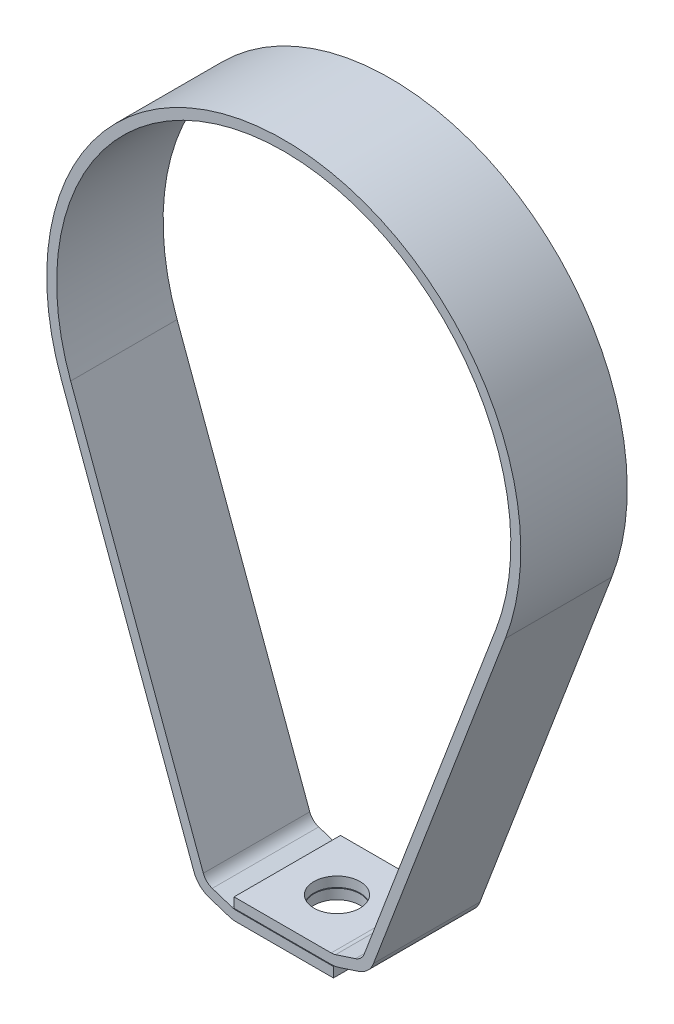
ISO-10303-21;
HEADER;
FILE_DESCRIPTION(('STEP AP214'),'2;1');
FILE_NAME('part.step','',(''),(''),'','','');
FILE_SCHEMA(('AUTOMOTIVE_DESIGN { 1 0 10303 214 1 1 1 1 }'));
ENDSEC;
DATA;
#1=APPLICATION_CONTEXT('core data for automotive mechanical design processes');
#2=APPLICATION_PROTOCOL_DEFINITION('international standard','automotive_design',2000,#1);
#3=PRODUCT_CONTEXT('',#1,'mechanical');
#4=PRODUCT('Part','Part','',(#3));
#5=PRODUCT_RELATED_PRODUCT_CATEGORY('part','',(#4));
#6=PRODUCT_DEFINITION_FORMATION('','',#4);
#7=PRODUCT_DEFINITION_CONTEXT('part definition',#1,'design');
#8=PRODUCT_DEFINITION('design','',#6,#7);
#9=PRODUCT_DEFINITION_SHAPE('','',#8);
#10=(LENGTH_UNIT() NAMED_UNIT(*) SI_UNIT(.MILLI.,.METRE.));
#11=(NAMED_UNIT(*) PLANE_ANGLE_UNIT() SI_UNIT($,.RADIAN.));
#12=(NAMED_UNIT(*) SI_UNIT($,.STERADIAN.) SOLID_ANGLE_UNIT());
#13=UNCERTAINTY_MEASURE_WITH_UNIT(LENGTH_MEASURE(1.E-05),#10,'distance_accuracy_value','');
#14=(GEOMETRIC_REPRESENTATION_CONTEXT(3) GLOBAL_UNCERTAINTY_ASSIGNED_CONTEXT((#13)) GLOBAL_UNIT_ASSIGNED_CONTEXT((#10,
#11,#12)) REPRESENTATION_CONTEXT('',''));
#15=CARTESIAN_POINT('',(0.,0.,0.));
#16=DIRECTION('',(0.,0.,1.));
#17=DIRECTION('',(1.,0.,0.));
#18=AXIS2_PLACEMENT_3D('',#15,#16,#17);
#19=CARTESIAN_POINT('',(0.,0.,7.5));
#20=DIRECTION('',(0.,0.,-1.));
#21=DIRECTION('',(-1.,0.,0.));
#22=AXIS2_PLACEMENT_3D('',#19,#20,#21);
#23=CYLINDRICAL_SURFACE('',#22,32.);
#24=CARTESIAN_POINT('',(0.,0.,-7.5));
#25=DIRECTION('',(0.,0.,-1.));
#26=DIRECTION('',(1.,0.,0.));
#27=AXIS2_PLACEMENT_3D('',#24,#25,#26);
#28=CIRCLE('',#27,32.);
#29=CARTESIAN_POINT('',(-30.0264995285157,-11.0638748214198,-7.5));
#30=VERTEX_POINT('',#29);
#31=CARTESIAN_POINT('',(29.9177759822603,-11.3545885119316,-7.5));
#32=VERTEX_POINT('',#31);
#33=EDGE_CURVE('E515',#30,#32,#28,.T.);
#34=ORIENTED_EDGE('',*,*,#33,.T.);
#35=DIRECTION('',(0.,0.,-1.));
#36=VECTOR('',#35,1.);
#37=CARTESIAN_POINT('',(29.9177759822603,-11.3545885119316,7.5));
#38=LINE('',#37,#36);
#39=CARTESIAN_POINT('',(29.9177759822603,-11.3545885119316,7.5));
#40=VERTEX_POINT('',#39);
#41=EDGE_CURVE('E11',#40,#32,#38,.T.);
#42=ORIENTED_EDGE('',*,*,#41,.F.);
#43=CARTESIAN_POINT('',(0.,0.,7.5));
#44=DIRECTION('',(0.,0.,-1.));
#45=DIRECTION('',(1.,0.,0.));
#46=AXIS2_PLACEMENT_3D('',#43,#44,#45);
#47=CIRCLE('',#46,32.);
#48=CARTESIAN_POINT('',(-30.0264995285157,-11.0638748214198,7.5));
#49=VERTEX_POINT('',#48);
#50=EDGE_CURVE('E579',#49,#40,#47,.T.);
#51=ORIENTED_EDGE('',*,*,#50,.F.);
#52=DIRECTION('',(0.,0.,-1.));
#53=VECTOR('',#52,1.);
#54=CARTESIAN_POINT('',(-30.0264995285157,-11.0638748214198,7.5));
#55=LINE('',#54,#53);
#56=EDGE_CURVE('E528',#49,#30,#55,.T.);
#57=ORIENTED_EDGE('',*,*,#56,.T.);
#58=EDGE_LOOP('',(#34,#42,#51,#57));
#59=FACE_BOUND('',#58,.T.);
#60=ADVANCED_FACE('F350',(#59),#23,.F.);
#61=CARTESIAN_POINT('',(29.9177759822603,-11.3545885119316,7.5));
#62=DIRECTION('',(0.934930499445635,-0.354830890997861,0.));
#63=DIRECTION('',(0.354830890997861,0.934930499445635,0.));
#64=AXIS2_PLACEMENT_3D('',#61,#62,#63);
#65=PLANE('',#64);
#66=DIRECTION('',(-0.354830890997861,-0.934930499445635,0.));
#67=VECTOR('',#66,1.);
#68=CARTESIAN_POINT('',(29.9177759822603,-11.3545885119316,-7.5));
#69=LINE('',#68,#67);
#70=CARTESIAN_POINT('',(11.3401418000534,-60.3040944459956,-7.5));
#71=VERTEX_POINT('',#70);
#72=EDGE_CURVE('E511',#32,#71,#69,.T.);
#73=ORIENTED_EDGE('',*,*,#72,.T.);
#74=DIRECTION('',(0.,0.,-1.));
#75=VECTOR('',#74,1.);
#76=CARTESIAN_POINT('',(11.3401418000534,-60.3040944459956,7.5));
#77=LINE('',#76,#75);
#78=CARTESIAN_POINT('',(11.3401418000534,-60.3040944459956,7.5));
#79=VERTEX_POINT('',#78);
#80=EDGE_CURVE('E358',#79,#71,#77,.T.);
#81=ORIENTED_EDGE('',*,*,#80,.F.);
#82=DIRECTION('',(-0.354830890997861,-0.934930499445635,0.));
#83=VECTOR('',#82,1.);
#84=CARTESIAN_POINT('',(29.9177759822603,-11.3545885119316,7.5));
#85=LINE('',#84,#83);
#86=EDGE_CURVE('E524',#40,#79,#85,.T.);
#87=ORIENTED_EDGE('',*,*,#86,.F.);
#88=ORIENTED_EDGE('',*,*,#41,.T.);
#89=EDGE_LOOP('',(#73,#81,#87,#88));
#90=FACE_BOUND('',#89,.T.);
#91=ADVANCED_FACE('F523',(#90),#65,.F.);
#92=CARTESIAN_POINT('',(9.47028080116208,-59.5944326639999,7.5));
#93=DIRECTION('',(0.,0.,-1.));
#94=DIRECTION('',(-1.,0.,0.));
#95=AXIS2_PLACEMENT_3D('',#92,#93,#94);
#96=CYLINDRICAL_SURFACE('',#95,2.00000000000001);
#97=CARTESIAN_POINT('',(9.47028080116208,-59.5944326639999,-7.5));
#98=DIRECTION('',(0.,0.,-1.));
#99=DIRECTION('',(-1.,0.,0.));
#100=AXIS2_PLACEMENT_3D('',#97,#98,#99);
#101=CIRCLE('',#100,2.00000000000001);
#102=CARTESIAN_POINT('',(10.088314789912,-61.4965456965902,-7.5));
#103=VERTEX_POINT('',#102);
#104=EDGE_CURVE('E517',#71,#103,#101,.T.);
#105=ORIENTED_EDGE('',*,*,#104,.T.);
#106=DIRECTION('',(0.,0.,-1.));
#107=VECTOR('',#106,1.);
#108=CARTESIAN_POINT('',(10.088314789912,-61.4965456965902,7.5));
#109=LINE('',#108,#107);
#110=CARTESIAN_POINT('',(10.088314789912,-61.4965456965902,7.5));
#111=VERTEX_POINT('',#110);
#112=EDGE_CURVE('E685',#111,#103,#109,.T.);
#113=ORIENTED_EDGE('',*,*,#112,.F.);
#114=CARTESIAN_POINT('',(9.47028080116208,-59.5944326639999,7.5));
#115=DIRECTION('',(0.,0.,-1.));
#116=DIRECTION('',(-1.,0.,0.));
#117=AXIS2_PLACEMENT_3D('',#114,#115,#116);
#118=CIRCLE('',#117,2.00000000000001);
#119=EDGE_CURVE('E582',#79,#111,#118,.T.);
#120=ORIENTED_EDGE('',*,*,#119,.F.);
#121=ORIENTED_EDGE('',*,*,#80,.T.);
#122=EDGE_LOOP('',(#105,#113,#120,#121));
#123=FACE_BOUND('',#122,.T.);
#124=ADVANCED_FACE('F690',(#123),#96,.F.);
#125=CARTESIAN_POINT('',(10.088314789912,-61.4965456965902,7.5));
#126=DIRECTION('',(0.309016994374942,-0.951056516295155,0.));
#127=DIRECTION('',(0.951056516295155,0.309016994374942,0.));
#128=AXIS2_PLACEMENT_3D('',#125,#126,#127);
#129=PLANE('',#128);
#130=DIRECTION('',(-0.951056516295155,-0.309016994374942,0.));
#131=VECTOR('',#130,1.);
#132=CARTESIAN_POINT('',(10.088314789912,-61.4965456965902,-7.5));
#133=LINE('',#132,#131);
#134=CARTESIAN_POINT('',(7.30126510810082,-62.4021130325903,-7.5));
#135=VERTEX_POINT('',#134);
#136=EDGE_CURVE('E537',#103,#135,#133,.T.);
#137=ORIENTED_EDGE('',*,*,#136,.T.);
#138=DIRECTION('',(0.,0.,-1.));
#139=VECTOR('',#138,1.);
#140=CARTESIAN_POINT('',(7.30126510810082,-62.4021130325903,7.5));
#141=LINE('',#140,#139);
#142=CARTESIAN_POINT('',(7.30126510810082,-62.4021130325903,7.5));
#143=VERTEX_POINT('',#142);
#144=EDGE_CURVE('E682',#143,#135,#141,.T.);
#145=ORIENTED_EDGE('',*,*,#144,.F.);
#146=DIRECTION('',(-0.951056516295155,-0.309016994374942,0.));
#147=VECTOR('',#146,1.);
#148=CARTESIAN_POINT('',(10.088314789912,-61.4965456965902,7.5));
#149=LINE('',#148,#147);
#150=EDGE_CURVE('E584',#111,#143,#149,.T.);
#151=ORIENTED_EDGE('',*,*,#150,.F.);
#152=ORIENTED_EDGE('',*,*,#112,.T.);
#153=EDGE_LOOP('',(#137,#145,#151,#152));
#154=FACE_BOUND('',#153,.T.);
#155=ADVANCED_FACE('F698',(#154),#129,.F.);
#156=CARTESIAN_POINT('',(6.68323111935093,-60.5,7.5));
#157=DIRECTION('',(0.,0.,-1.));
#158=DIRECTION('',(-1.,0.,0.));
#159=AXIS2_PLACEMENT_3D('',#156,#157,#158);
#160=CYLINDRICAL_SURFACE('',#159,2.);
#161=CARTESIAN_POINT('',(6.68323111935093,-60.5,-7.5));
#162=DIRECTION('',(0.,0.,-1.));
#163=DIRECTION('',(-1.,0.,0.));
#164=AXIS2_PLACEMENT_3D('',#161,#162,#163);
#165=CIRCLE('',#164,2.);
#166=CARTESIAN_POINT('',(6.68323111935093,-62.5,-7.5));
#167=VERTEX_POINT('',#166);
#168=EDGE_CURVE('E539',#135,#167,#165,.T.);
#169=ORIENTED_EDGE('',*,*,#168,.T.);
#170=DIRECTION('',(0.,0.,-1.));
#171=VECTOR('',#170,1.);
#172=CARTESIAN_POINT('',(6.68323111935093,-62.5,7.5));
#173=LINE('',#172,#171);
#174=CARTESIAN_POINT('',(6.68323111935093,-62.5,7.5));
#175=VERTEX_POINT('',#174);
#176=EDGE_CURVE('E679',#175,#167,#173,.T.);
#177=ORIENTED_EDGE('',*,*,#176,.F.);
#178=CARTESIAN_POINT('',(6.68323111935093,-60.5,7.5));
#179=DIRECTION('',(0.,0.,-1.));
#180=DIRECTION('',(-1.,0.,0.));
#181=AXIS2_PLACEMENT_3D('',#178,#179,#180);
#182=CIRCLE('',#181,2.);
#183=EDGE_CURVE('E586',#143,#175,#182,.T.);
#184=ORIENTED_EDGE('',*,*,#183,.F.);
#185=ORIENTED_EDGE('',*,*,#144,.T.);
#186=EDGE_LOOP('',(#169,#177,#184,#185));
#187=FACE_BOUND('',#186,.T.);
#188=ADVANCED_FACE('F701',(#187),#160,.F.);
#189=CARTESIAN_POINT('',(6.68323111935093,-62.5,7.5));
#190=DIRECTION('',(0.,-1.,0.));
#191=DIRECTION('',(0.,0.,-1.));
#192=AXIS2_PLACEMENT_3D('',#189,#190,#191);
#193=PLANE('',#192);
#194=CARTESIAN_POINT('',(0.,-62.5,0.));
#195=DIRECTION('',(0.,-1.,0.));
#196=DIRECTION('',(0.,0.,-1.));
#197=AXIS2_PLACEMENT_3D('',#194,#195,#196);
#198=CIRCLE('',#197,3.25);
#199=CARTESIAN_POINT('',(0.,-62.5,-3.25));
#200=VERTEX_POINT('',#199);
#201=EDGE_CURVE('E529',#200,#200,#198,.T.);
#202=ORIENTED_EDGE('',*,*,#201,.T.);
#203=EDGE_LOOP('',(#202));
#204=FACE_BOUND('',#203,.T.);
#205=DIRECTION('',(-1.,0.,0.));
#206=VECTOR('',#205,1.);
#207=CARTESIAN_POINT('',(6.68323111935093,-62.5,-7.5));
#208=LINE('',#207,#206);
#209=CARTESIAN_POINT('',(-6.99999999999999,-62.5,-7.5));
#210=VERTEX_POINT('',#209);
#211=EDGE_CURVE('E541',#167,#210,#208,.T.);
#212=ORIENTED_EDGE('',*,*,#211,.T.);
#213=DIRECTION('',(0.,0.,-1.));
#214=VECTOR('',#213,1.);
#215=CARTESIAN_POINT('',(-6.99999999999999,-62.5,7.5));
#216=LINE('',#215,#214);
#217=CARTESIAN_POINT('',(-6.99999999999999,-62.5,7.5));
#218=VERTEX_POINT('',#217);
#219=EDGE_CURVE('E676',#218,#210,#216,.T.);
#220=ORIENTED_EDGE('',*,*,#219,.F.);
#221=DIRECTION('',(-1.,0.,0.));
#222=VECTOR('',#221,1.);
#223=CARTESIAN_POINT('',(6.68323111935093,-62.5,7.5));
#224=LINE('',#223,#222);
#225=EDGE_CURVE('E588',#175,#218,#224,.T.);
#226=ORIENTED_EDGE('',*,*,#225,.F.);
#227=ORIENTED_EDGE('',*,*,#176,.T.);
#228=EDGE_LOOP('',(#212,#220,#226,#227));
#229=FACE_BOUND('',#228,.T.);
#230=ADVANCED_FACE('F706',(#204,#229),#193,.F.);
#231=CARTESIAN_POINT('',(-6.99999999999999,-62.5,7.5));
#232=DIRECTION('',(1.,0.,0.));
#233=DIRECTION('',(0.,0.,-1.));
#234=AXIS2_PLACEMENT_3D('',#231,#232,#233);
#235=PLANE('',#234);
#236=DIRECTION('',(0.,-1.,0.));
#237=VECTOR('',#236,1.);
#238=CARTESIAN_POINT('',(-6.99999999999999,-62.5,-7.5));
#239=LINE('',#238,#237);
#240=CARTESIAN_POINT('',(-6.99999999999999,-63.9,-7.5));
#241=VERTEX_POINT('',#240);
#242=EDGE_CURVE('E543',#210,#241,#239,.T.);
#243=ORIENTED_EDGE('',*,*,#242,.T.);
#244=DIRECTION('',(0.,0.,-1.));
#245=VECTOR('',#244,1.);
#246=CARTESIAN_POINT('',(-6.99999999999999,-63.9,7.5));
#247=LINE('',#246,#245);
#248=CARTESIAN_POINT('',(-6.99999999999999,-63.9,7.5));
#249=VERTEX_POINT('',#248);
#250=EDGE_CURVE('E673',#249,#241,#247,.T.);
#251=ORIENTED_EDGE('',*,*,#250,.F.);
#252=DIRECTION('',(0.,-1.,0.));
#253=VECTOR('',#252,1.);
#254=CARTESIAN_POINT('',(-6.99999999999999,-62.5,7.5));
#255=LINE('',#254,#253);
#256=EDGE_CURVE('E590',#218,#249,#255,.T.);
#257=ORIENTED_EDGE('',*,*,#256,.F.);
#258=ORIENTED_EDGE('',*,*,#219,.T.);
#259=EDGE_LOOP('',(#243,#251,#257,#258));
#260=FACE_BOUND('',#259,.T.);
#261=ADVANCED_FACE('F712',(#260),#235,.F.);
#262=CARTESIAN_POINT('',(6.68323111935093,-63.9,7.5));
#263=DIRECTION('',(0.,1.,0.));
#264=DIRECTION('',(0.,0.,1.));
#265=AXIS2_PLACEMENT_3D('',#262,#263,#264);
#266=PLANE('',#265);
#267=CARTESIAN_POINT('',(0.,-63.9,0.));
#268=DIRECTION('',(0.,1.,0.));
#269=DIRECTION('',(0.,0.,1.));
#270=AXIS2_PLACEMENT_3D('',#267,#268,#269);
#271=CIRCLE('',#270,3.25);
#272=CARTESIAN_POINT('',(0.,-63.9,3.25));
#273=VERTEX_POINT('',#272);
#274=EDGE_CURVE('E532',#273,#273,#271,.T.);
#275=ORIENTED_EDGE('',*,*,#274,.T.);
#276=EDGE_LOOP('',(#275));
#277=FACE_BOUND('',#276,.T.);
#278=DIRECTION('',(1.,0.,0.));
#279=VECTOR('',#278,1.);
#280=CARTESIAN_POINT('',(6.68323111935093,-63.9,-7.5));
#281=LINE('',#280,#279);
#282=CARTESIAN_POINT('',(6.68323111935093,-63.9,-7.5));
#283=VERTEX_POINT('',#282);
#284=EDGE_CURVE('E545',#241,#283,#281,.T.);
#285=ORIENTED_EDGE('',*,*,#284,.T.);
#286=DIRECTION('',(0.,0.,-1.));
#287=VECTOR('',#286,1.);
#288=CARTESIAN_POINT('',(6.68323111935093,-63.9,7.5));
#289=LINE('',#288,#287);
#290=CARTESIAN_POINT('',(6.68323111935093,-63.9,7.5));
#291=VERTEX_POINT('',#290);
#292=EDGE_CURVE('E670',#291,#283,#289,.T.);
#293=ORIENTED_EDGE('',*,*,#292,.F.);
#294=DIRECTION('',(1.,0.,0.));
#295=VECTOR('',#294,1.);
#296=CARTESIAN_POINT('',(6.68323111935093,-63.9,7.5));
#297=LINE('',#296,#295);
#298=EDGE_CURVE('E592',#249,#291,#297,.T.);
#299=ORIENTED_EDGE('',*,*,#298,.F.);
#300=ORIENTED_EDGE('',*,*,#250,.T.);
#301=EDGE_LOOP('',(#285,#293,#299,#300));
#302=FACE_BOUND('',#301,.T.);
#303=ADVANCED_FACE('F716',(#277,#302),#266,.F.);
#304=CARTESIAN_POINT('',(6.68323111935093,-60.5,7.5));
#305=DIRECTION('',(0.,0.,-1.));
#306=DIRECTION('',(-1.,0.,0.));
#307=AXIS2_PLACEMENT_3D('',#304,#305,#306);
#308=CYLINDRICAL_SURFACE('',#307,3.4);
#309=CARTESIAN_POINT('',(6.68323111935093,-60.5,-7.5));
#310=DIRECTION('',(0.,0.,1.));
#311=DIRECTION('',(-1.,0.,0.));
#312=AXIS2_PLACEMENT_3D('',#309,#310,#311);
#313=CIRCLE('',#312,3.4);
#314=CARTESIAN_POINT('',(7.73388890022574,-63.7335921554035,-7.5));
#315=VERTEX_POINT('',#314);
#316=EDGE_CURVE('E547',#283,#315,#313,.T.);
#317=ORIENTED_EDGE('',*,*,#316,.T.);
#318=DIRECTION('',(0.,0.,-1.));
#319=VECTOR('',#318,1.);
#320=CARTESIAN_POINT('',(7.73388890022574,-63.7335921554035,7.5));
#321=LINE('',#320,#319);
#322=CARTESIAN_POINT('',(7.73388890022574,-63.7335921554035,7.5));
#323=VERTEX_POINT('',#322);
#324=EDGE_CURVE('E667',#323,#315,#321,.T.);
#325=ORIENTED_EDGE('',*,*,#324,.F.);
#326=CARTESIAN_POINT('',(6.68323111935093,-60.5,7.5));
#327=DIRECTION('',(0.,0.,1.));
#328=DIRECTION('',(-1.,0.,0.));
#329=AXIS2_PLACEMENT_3D('',#326,#327,#328);
#330=CIRCLE('',#329,3.4);
#331=EDGE_CURVE('E594',#291,#323,#330,.T.);
#332=ORIENTED_EDGE('',*,*,#331,.F.);
#333=ORIENTED_EDGE('',*,*,#292,.T.);
#334=EDGE_LOOP('',(#317,#325,#332,#333));
#335=FACE_BOUND('',#334,.T.);
#336=ADVANCED_FACE('F721',(#335),#308,.T.);
#337=CARTESIAN_POINT('',(10.5209385820369,-62.8280248194034,7.5));
#338=DIRECTION('',(-0.309016994374947,0.951056516295154,0.));
#339=DIRECTION('',(-0.951056516295154,-0.309016994374947,0.));
#340=AXIS2_PLACEMENT_3D('',#337,#338,#339);
#341=PLANE('',#340);
#342=DIRECTION('',(0.951056516295154,0.309016994374947,0.));
#343=VECTOR('',#342,1.);
#344=CARTESIAN_POINT('',(10.5209385820369,-62.8280248194034,-7.5));
#345=LINE('',#344,#343);
#346=CARTESIAN_POINT('',(10.5209385820369,-62.8280248194034,-7.5));
#347=VERTEX_POINT('',#346);
#348=EDGE_CURVE('E549',#315,#347,#345,.T.);
#349=ORIENTED_EDGE('',*,*,#348,.T.);
#350=DIRECTION('',(0.,0.,-1.));
#351=VECTOR('',#350,1.);
#352=CARTESIAN_POINT('',(10.5209385820369,-62.8280248194034,7.5));
#353=LINE('',#352,#351);
#354=CARTESIAN_POINT('',(10.5209385820369,-62.8280248194034,7.5));
#355=VERTEX_POINT('',#354);
#356=EDGE_CURVE('E664',#355,#347,#353,.T.);
#357=ORIENTED_EDGE('',*,*,#356,.F.);
#358=DIRECTION('',(0.951056516295154,0.309016994374947,0.));
#359=VECTOR('',#358,1.);
#360=CARTESIAN_POINT('',(10.5209385820369,-62.8280248194034,7.5));
#361=LINE('',#360,#359);
#362=EDGE_CURVE('E596',#323,#355,#361,.T.);
#363=ORIENTED_EDGE('',*,*,#362,.F.);
#364=ORIENTED_EDGE('',*,*,#324,.T.);
#365=EDGE_LOOP('',(#349,#357,#363,#364));
#366=FACE_BOUND('',#365,.T.);
#367=ADVANCED_FACE('F727',(#366),#341,.F.);
#368=CARTESIAN_POINT('',(9.47028080116208,-59.5944326639999,7.5));
#369=DIRECTION('',(0.,0.,-1.));
#370=DIRECTION('',(-1.,0.,0.));
#371=AXIS2_PLACEMENT_3D('',#368,#369,#370);
#372=CYLINDRICAL_SURFACE('',#371,3.4);
#373=CARTESIAN_POINT('',(9.47028080116208,-59.5944326639999,-7.5));
#374=DIRECTION('',(0.,0.,1.));
#375=DIRECTION('',(-1.,0.,0.));
#376=AXIS2_PLACEMENT_3D('',#373,#374,#375);
#377=CIRCLE('',#376,3.4);
#378=CARTESIAN_POINT('',(12.6490444992772,-60.8008576933926,-7.5));
#379=VERTEX_POINT('',#378);
#380=EDGE_CURVE('E551',#347,#379,#377,.T.);
#381=ORIENTED_EDGE('',*,*,#380,.T.);
#382=DIRECTION('',(0.,0.,-1.));
#383=VECTOR('',#382,1.);
#384=CARTESIAN_POINT('',(12.6490444992772,-60.8008576933926,7.5));
#385=LINE('',#384,#383);
#386=CARTESIAN_POINT('',(12.6490444992772,-60.8008576933926,7.5));
#387=VERTEX_POINT('',#386);
#388=EDGE_CURVE('E661',#387,#379,#385,.T.);
#389=ORIENTED_EDGE('',*,*,#388,.F.);
#390=CARTESIAN_POINT('',(9.47028080116208,-59.5944326639999,7.5));
#391=DIRECTION('',(0.,0.,1.));
#392=DIRECTION('',(-1.,0.,0.));
#393=AXIS2_PLACEMENT_3D('',#390,#391,#392);
#394=CIRCLE('',#393,3.4);
#395=EDGE_CURVE('E598',#355,#387,#394,.T.);
#396=ORIENTED_EDGE('',*,*,#395,.F.);
#397=ORIENTED_EDGE('',*,*,#356,.T.);
#398=EDGE_LOOP('',(#381,#389,#396,#397));
#399=FACE_BOUND('',#398,.T.);
#400=ADVANCED_FACE('F731',(#399),#372,.T.);
#401=CARTESIAN_POINT('',(31.2266786814842,-11.8513517593286,7.5));
#402=DIRECTION('',(-0.934930499445635,0.354830890997861,0.));
#403=DIRECTION('',(-0.354830890997861,-0.934930499445635,0.));
#404=AXIS2_PLACEMENT_3D('',#401,#402,#403);
#405=PLANE('',#404);
#406=DIRECTION('',(0.354830890997861,0.934930499445635,0.));
#407=VECTOR('',#406,1.);
#408=CARTESIAN_POINT('',(31.2266786814842,-11.8513517593286,-7.5));
#409=LINE('',#408,#407);
#410=CARTESIAN_POINT('',(31.2266786814842,-11.8513517593286,-7.5));
#411=VERTEX_POINT('',#410);
#412=EDGE_CURVE('E553',#379,#411,#409,.T.);
#413=ORIENTED_EDGE('',*,*,#412,.T.);
#414=DIRECTION('',(0.,0.,-1.));
#415=VECTOR('',#414,1.);
#416=CARTESIAN_POINT('',(31.2266786814842,-11.8513517593286,7.5));
#417=LINE('',#416,#415);
#418=CARTESIAN_POINT('',(31.2266786814842,-11.8513517593286,7.5));
#419=VERTEX_POINT('',#418);
#420=EDGE_CURVE('E658',#419,#411,#417,.T.);
#421=ORIENTED_EDGE('',*,*,#420,.F.);
#422=DIRECTION('',(0.354830890997861,0.934930499445635,0.));
#423=VECTOR('',#422,1.);
#424=CARTESIAN_POINT('',(31.2266786814842,-11.8513517593286,7.5));
#425=LINE('',#424,#423);
#426=EDGE_CURVE('E600',#387,#419,#425,.T.);
#427=ORIENTED_EDGE('',*,*,#426,.F.);
#428=ORIENTED_EDGE('',*,*,#388,.T.);
#429=EDGE_LOOP('',(#413,#421,#427,#428));
#430=FACE_BOUND('',#429,.T.);
#431=ADVANCED_FACE('F736',(#430),#405,.F.);
#432=CARTESIAN_POINT('',(0.,0.,7.5));
#433=DIRECTION('',(0.,0.,-1.));
#434=DIRECTION('',(-1.,0.,0.));
#435=AXIS2_PLACEMENT_3D('',#432,#433,#434);
#436=CYLINDRICAL_SURFACE('',#435,33.4);
#437=CARTESIAN_POINT('',(0.,0.,-7.5));
#438=DIRECTION('',(0.,0.,1.));
#439=DIRECTION('',(1.,0.,0.));
#440=AXIS2_PLACEMENT_3D('',#437,#438,#439);
#441=CIRCLE('',#440,33.4);
#442=CARTESIAN_POINT('',(-31.3401588828883,-11.5479193448569,-7.5));
#443=VERTEX_POINT('',#442);
#444=EDGE_CURVE('E555',#411,#443,#441,.T.);
#445=ORIENTED_EDGE('',*,*,#444,.T.);
#446=DIRECTION('',(0.,0.,-1.));
#447=VECTOR('',#446,1.);
#448=CARTESIAN_POINT('',(-31.3401588828883,-11.5479193448569,7.5));
#449=LINE('',#448,#447);
#450=CARTESIAN_POINT('',(-31.3401588828883,-11.5479193448569,7.5));
#451=VERTEX_POINT('',#450);
#452=EDGE_CURVE('E655',#451,#443,#449,.T.);
#453=ORIENTED_EDGE('',*,*,#452,.F.);
#454=CARTESIAN_POINT('',(0.,0.,7.5));
#455=DIRECTION('',(0.,0.,1.));
#456=DIRECTION('',(1.,0.,0.));
#457=AXIS2_PLACEMENT_3D('',#454,#455,#456);
#458=CIRCLE('',#457,33.4);
#459=EDGE_CURVE('E602',#419,#451,#458,.T.);
#460=ORIENTED_EDGE('',*,*,#459,.F.);
#461=ORIENTED_EDGE('',*,*,#420,.T.);
#462=EDGE_LOOP('',(#445,#453,#460,#461));
#463=FACE_BOUND('',#462,.T.);
#464=ADVANCED_FACE('F742',(#463),#436,.T.);
#465=CARTESIAN_POINT('',(-31.3401588828883,-11.5479193448569,7.5));
#466=DIRECTION('',(0.938328110266116,0.345746088169368,0.));
#467=DIRECTION('',(-0.345746088169368,0.938328110266116,0.));
#468=AXIS2_PLACEMENT_3D('',#465,#466,#467);
#469=PLANE('',#468);
#470=DIRECTION('',(0.345746088169368,-0.938328110266116,0.));
#471=VECTOR('',#470,1.);
#472=CARTESIAN_POINT('',(-31.3401588828883,-11.5479193448569,-7.5));
#473=LINE('',#472,#471);
#474=CARTESIAN_POINT('',(-12.6492260101023,-62.273663819631,-7.5));
#475=VERTEX_POINT('',#474);
#476=EDGE_CURVE('E557',#443,#475,#473,.T.);
#477=ORIENTED_EDGE('',*,*,#476,.T.);
#478=DIRECTION('',(0.,0.,-1.));
#479=VECTOR('',#478,1.);
#480=CARTESIAN_POINT('',(-12.6492260101023,-62.273663819631,7.5));
#481=LINE('',#480,#479);
#482=CARTESIAN_POINT('',(-12.6492260101023,-62.273663819631,7.5));
#483=VERTEX_POINT('',#482);
#484=EDGE_CURVE('E652',#483,#475,#481,.T.);
#485=ORIENTED_EDGE('',*,*,#484,.F.);
#486=DIRECTION('',(0.345746088169368,-0.938328110266116,0.));
#487=VECTOR('',#486,1.);
#488=CARTESIAN_POINT('',(-31.3401588828883,-11.5479193448569,7.5));
#489=LINE('',#488,#487);
#490=EDGE_CURVE('E604',#451,#483,#489,.T.);
#491=ORIENTED_EDGE('',*,*,#490,.F.);
#492=ORIENTED_EDGE('',*,*,#452,.T.);
#493=EDGE_LOOP('',(#477,#485,#491,#492));
#494=FACE_BOUND('',#493,.T.);
#495=ADVANCED_FACE('F746',(#494),#469,.F.);
#496=CARTESIAN_POINT('',(-9.45891043519748,-61.0981271198552,7.5));
#497=DIRECTION('',(0.,0.,-1.));
#498=DIRECTION('',(-1.,0.,0.));
#499=AXIS2_PLACEMENT_3D('',#496,#497,#498);
#500=CYLINDRICAL_SURFACE('',#499,3.39999999999999);
#501=CARTESIAN_POINT('',(-9.45891043519748,-61.0981271198552,-7.5));
#502=DIRECTION('',(0.,0.,1.));
#503=DIRECTION('',(1.,0.,0.));
#504=AXIS2_PLACEMENT_3D('',#501,#502,#503);
#505=CIRCLE('',#504,3.39999999999999);
#506=CARTESIAN_POINT('',(-10.5095682160723,-64.3317192752587,-7.5));
#507=VERTEX_POINT('',#506);
#508=EDGE_CURVE('E559',#475,#507,#505,.T.);
#509=ORIENTED_EDGE('',*,*,#508,.T.);
#510=DIRECTION('',(0.,0.,-1.));
#511=VECTOR('',#510,1.);
#512=CARTESIAN_POINT('',(-10.5095682160723,-64.3317192752587,7.5));
#513=LINE('',#512,#511);
#514=CARTESIAN_POINT('',(-10.5095682160723,-64.3317192752587,7.5));
#515=VERTEX_POINT('',#514);
#516=EDGE_CURVE('E649',#515,#507,#513,.T.);
#517=ORIENTED_EDGE('',*,*,#516,.F.);
#518=CARTESIAN_POINT('',(-9.45891043519748,-61.0981271198552,7.5));
#519=DIRECTION('',(0.,0.,1.));
#520=DIRECTION('',(1.,0.,0.));
#521=AXIS2_PLACEMENT_3D('',#518,#519,#520);
#522=CIRCLE('',#521,3.39999999999999);
#523=EDGE_CURVE('E606',#483,#515,#522,.T.);
#524=ORIENTED_EDGE('',*,*,#523,.F.);
#525=ORIENTED_EDGE('',*,*,#484,.T.);
#526=EDGE_LOOP('',(#509,#517,#524,#525));
#527=FACE_BOUND('',#526,.T.);
#528=ADVANCED_FACE('F751',(#527),#500,.T.);
#529=CARTESIAN_POINT('',(-10.5095682160723,-64.3317192752587,7.5));
#530=DIRECTION('',(0.309016994374948,0.951056516295154,0.));
#531=DIRECTION('',(-0.951056516295154,0.309016994374948,0.));
#532=AXIS2_PLACEMENT_3D('',#529,#530,#531);
#533=PLANE('',#532);
#534=DIRECTION('',(0.951056516295154,-0.309016994374948,0.));
#535=VECTOR('',#534,1.);
#536=CARTESIAN_POINT('',(-10.5095682160723,-64.3317192752587,-7.5));
#537=LINE('',#536,#535);
#538=CARTESIAN_POINT('',(-7.73388890022571,-65.2335921554035,-7.5));
#539=VERTEX_POINT('',#538);
#540=EDGE_CURVE('E561',#507,#539,#537,.T.);
#541=ORIENTED_EDGE('',*,*,#540,.T.);
#542=DIRECTION('',(0.,0.,-1.));
#543=VECTOR('',#542,1.);
#544=CARTESIAN_POINT('',(-7.73388890022571,-65.2335921554035,7.5));
#545=LINE('',#544,#543);
#546=CARTESIAN_POINT('',(-7.73388890022571,-65.2335921554035,7.5));
#547=VERTEX_POINT('',#546);
#548=EDGE_CURVE('E646',#547,#539,#545,.T.);
#549=ORIENTED_EDGE('',*,*,#548,.F.);
#550=DIRECTION('',(0.951056516295154,-0.309016994374948,0.));
#551=VECTOR('',#550,1.);
#552=CARTESIAN_POINT('',(-10.5095682160723,-64.3317192752587,7.5));
#553=LINE('',#552,#551);
#554=EDGE_CURVE('E608',#515,#547,#553,.T.);
#555=ORIENTED_EDGE('',*,*,#554,.F.);
#556=ORIENTED_EDGE('',*,*,#516,.T.);
#557=EDGE_LOOP('',(#541,#549,#555,#556));
#558=FACE_BOUND('',#557,.T.);
#559=ADVANCED_FACE('F757',(#558),#533,.F.);
#560=CARTESIAN_POINT('',(-6.68323111935091,-62.,7.5));
#561=DIRECTION('',(0.,0.,-1.));
#562=DIRECTION('',(-1.,0.,0.));
#563=AXIS2_PLACEMENT_3D('',#560,#561,#562);
#564=CYLINDRICAL_SURFACE('',#563,3.39999999999999);
#565=CARTESIAN_POINT('',(-6.68323111935091,-62.,-7.5));
#566=DIRECTION('',(0.,0.,1.));
#567=DIRECTION('',(-1.,0.,0.));
#568=AXIS2_PLACEMENT_3D('',#565,#566,#567);
#569=CIRCLE('',#568,3.39999999999999);
#570=CARTESIAN_POINT('',(-6.68323111935091,-65.4,-7.5));
#571=VERTEX_POINT('',#570);
#572=EDGE_CURVE('E563',#539,#571,#569,.T.);
#573=ORIENTED_EDGE('',*,*,#572,.T.);
#574=DIRECTION('',(0.,0.,-1.));
#575=VECTOR('',#574,1.);
#576=CARTESIAN_POINT('',(-6.68323111935091,-65.4,7.5));
#577=LINE('',#576,#575);
#578=CARTESIAN_POINT('',(-6.68323111935091,-65.4,7.5));
#579=VERTEX_POINT('',#578);
#580=EDGE_CURVE('E643',#579,#571,#577,.T.);
#581=ORIENTED_EDGE('',*,*,#580,.F.);
#582=CARTESIAN_POINT('',(-6.68323111935091,-62.,7.5));
#583=DIRECTION('',(0.,0.,1.));
#584=DIRECTION('',(-1.,0.,0.));
#585=AXIS2_PLACEMENT_3D('',#582,#583,#584);
#586=CIRCLE('',#585,3.39999999999999);
#587=EDGE_CURVE('E610',#547,#579,#586,.T.);
#588=ORIENTED_EDGE('',*,*,#587,.F.);
#589=ORIENTED_EDGE('',*,*,#548,.T.);
#590=EDGE_LOOP('',(#573,#581,#588,#589));
#591=FACE_BOUND('',#590,.T.);
#592=ADVANCED_FACE('F761',(#591),#564,.T.);
#593=CARTESIAN_POINT('',(-6.68323111935091,-65.4,7.5));
#594=DIRECTION('',(0.,1.,0.));
#595=DIRECTION('',(-1.,0.,0.));
#596=AXIS2_PLACEMENT_3D('',#593,#594,#595);
#597=PLANE('',#596);
#598=CARTESIAN_POINT('',(0.,-65.4,0.));
#599=DIRECTION('',(0.,-1.,0.));
#600=DIRECTION('',(0.,0.,-1.));
#601=AXIS2_PLACEMENT_3D('',#598,#599,#600);
#602=CIRCLE('',#601,3.25);
#603=CARTESIAN_POINT('',(0.,-65.4,-3.25));
#604=VERTEX_POINT('',#603);
#605=EDGE_CURVE('E892',#604,#604,#602,.T.);
#606=ORIENTED_EDGE('',*,*,#605,.F.);
#607=EDGE_LOOP('',(#606));
#608=FACE_BOUND('',#607,.T.);
#609=DIRECTION('',(1.,0.,0.));
#610=VECTOR('',#609,1.);
#611=CARTESIAN_POINT('',(-6.68323111935091,-65.4,-7.5));
#612=LINE('',#611,#610);
#613=CARTESIAN_POINT('',(7.00000000000001,-65.4,-7.5));
#614=VERTEX_POINT('',#613);
#615=EDGE_CURVE('E565',#571,#614,#612,.T.);
#616=ORIENTED_EDGE('',*,*,#615,.T.);
#617=DIRECTION('',(0.,0.,-1.));
#618=VECTOR('',#617,1.);
#619=CARTESIAN_POINT('',(7.00000000000001,-65.4,7.5));
#620=LINE('',#619,#618);
#621=CARTESIAN_POINT('',(7.00000000000001,-65.4,7.5));
#622=VERTEX_POINT('',#621);
#623=EDGE_CURVE('E640',#622,#614,#620,.T.);
#624=ORIENTED_EDGE('',*,*,#623,.F.);
#625=DIRECTION('',(1.,0.,0.));
#626=VECTOR('',#625,1.);
#627=CARTESIAN_POINT('',(-6.68323111935091,-65.4,7.5));
#628=LINE('',#627,#626);
#629=EDGE_CURVE('E612',#579,#622,#628,.T.);
#630=ORIENTED_EDGE('',*,*,#629,.F.);
#631=ORIENTED_EDGE('',*,*,#580,.T.);
#632=EDGE_LOOP('',(#616,#624,#630,#631));
#633=FACE_BOUND('',#632,.T.);
#634=ADVANCED_FACE('F766',(#608,#633),#597,.F.);
#635=CARTESIAN_POINT('',(7.00000000000001,-65.4,7.5));
#636=DIRECTION('',(-1.,0.,0.));
#637=DIRECTION('',(0.,0.,1.));
#638=AXIS2_PLACEMENT_3D('',#635,#636,#637);
#639=PLANE('',#638);
#640=DIRECTION('',(0.,1.,0.));
#641=VECTOR('',#640,1.);
#642=CARTESIAN_POINT('',(7.00000000000001,-65.4,-7.5));
#643=LINE('',#642,#641);
#644=CARTESIAN_POINT('',(7.00000000000001,-64.,-7.5));
#645=VERTEX_POINT('',#644);
#646=EDGE_CURVE('E567',#614,#645,#643,.T.);
#647=ORIENTED_EDGE('',*,*,#646,.T.);
#648=DIRECTION('',(0.,0.,-1.));
#649=VECTOR('',#648,1.);
#650=CARTESIAN_POINT('',(7.00000000000001,-64.,7.5));
#651=LINE('',#650,#649);
#652=CARTESIAN_POINT('',(7.00000000000001,-64.,7.5));
#653=VERTEX_POINT('',#652);
#654=EDGE_CURVE('E637',#653,#645,#651,.T.);
#655=ORIENTED_EDGE('',*,*,#654,.F.);
#656=DIRECTION('',(0.,1.,0.));
#657=VECTOR('',#656,1.);
#658=CARTESIAN_POINT('',(7.00000000000001,-65.4,7.5));
#659=LINE('',#658,#657);
#660=EDGE_CURVE('E614',#622,#653,#659,.T.);
#661=ORIENTED_EDGE('',*,*,#660,.F.);
#662=ORIENTED_EDGE('',*,*,#623,.T.);
#663=EDGE_LOOP('',(#647,#655,#661,#662));
#664=FACE_BOUND('',#663,.T.);
#665=ADVANCED_FACE('F772',(#664),#639,.F.);
#666=CARTESIAN_POINT('',(-6.68323111935091,-64.,7.5));
#667=DIRECTION('',(0.,-1.,0.));
#668=DIRECTION('',(0.,0.,-1.));
#669=AXIS2_PLACEMENT_3D('',#666,#667,#668);
#670=PLANE('',#669);
#671=CARTESIAN_POINT('',(0.,-64.,0.));
#672=DIRECTION('',(0.,-1.,0.));
#673=DIRECTION('',(0.,0.,-1.));
#674=AXIS2_PLACEMENT_3D('',#671,#672,#673);
#675=CIRCLE('',#674,3.25);
#676=CARTESIAN_POINT('',(0.,-64.,-3.25));
#677=VERTEX_POINT('',#676);
#678=EDGE_CURVE('E353',#677,#677,#675,.T.);
#679=ORIENTED_EDGE('',*,*,#678,.T.);
#680=EDGE_LOOP('',(#679));
#681=FACE_BOUND('',#680,.T.);
#682=DIRECTION('',(-1.,0.,0.));
#683=VECTOR('',#682,1.);
#684=CARTESIAN_POINT('',(-6.68323111935091,-64.,-7.5));
#685=LINE('',#684,#683);
#686=CARTESIAN_POINT('',(-6.68323111935091,-64.,-7.5));
#687=VERTEX_POINT('',#686);
#688=EDGE_CURVE('E569',#645,#687,#685,.T.);
#689=ORIENTED_EDGE('',*,*,#688,.T.);
#690=DIRECTION('',(0.,0.,-1.));
#691=VECTOR('',#690,1.);
#692=CARTESIAN_POINT('',(-6.68323111935091,-64.,7.5));
#693=LINE('',#692,#691);
#694=CARTESIAN_POINT('',(-6.68323111935091,-64.,7.5));
#695=VERTEX_POINT('',#694);
#696=EDGE_CURVE('E634',#695,#687,#693,.T.);
#697=ORIENTED_EDGE('',*,*,#696,.F.);
#698=DIRECTION('',(-1.,0.,0.));
#699=VECTOR('',#698,1.);
#700=CARTESIAN_POINT('',(-6.68323111935091,-64.,7.5));
#701=LINE('',#700,#699);
#702=EDGE_CURVE('E616',#653,#695,#701,.T.);
#703=ORIENTED_EDGE('',*,*,#702,.F.);
#704=ORIENTED_EDGE('',*,*,#654,.T.);
#705=EDGE_LOOP('',(#689,#697,#703,#704));
#706=FACE_BOUND('',#705,.T.);
#707=ADVANCED_FACE('F776',(#681,#706),#670,.F.);
#708=CARTESIAN_POINT('',(-6.68323111935091,-62.,7.5));
#709=DIRECTION('',(0.,0.,-1.));
#710=DIRECTION('',(-1.,0.,0.));
#711=AXIS2_PLACEMENT_3D('',#708,#709,#710);
#712=CYLINDRICAL_SURFACE('',#711,2.00000000000001);
#713=CARTESIAN_POINT('',(-6.68323111935091,-62.,-7.5));
#714=DIRECTION('',(0.,0.,-1.));
#715=DIRECTION('',(-1.,0.,0.));
#716=AXIS2_PLACEMENT_3D('',#713,#714,#715);
#717=CIRCLE('',#716,2.00000000000001);
#718=CARTESIAN_POINT('',(-7.3012651081008,-63.9021130325903,-7.5));
#719=VERTEX_POINT('',#718);
#720=EDGE_CURVE('E571',#687,#719,#717,.T.);
#721=ORIENTED_EDGE('',*,*,#720,.T.);
#722=DIRECTION('',(0.,0.,-1.));
#723=VECTOR('',#722,1.);
#724=CARTESIAN_POINT('',(-7.3012651081008,-63.9021130325903,7.5));
#725=LINE('',#724,#723);
#726=CARTESIAN_POINT('',(-7.3012651081008,-63.9021130325903,7.5));
#727=VERTEX_POINT('',#726);
#728=EDGE_CURVE('E631',#727,#719,#725,.T.);
#729=ORIENTED_EDGE('',*,*,#728,.F.);
#730=CARTESIAN_POINT('',(-6.68323111935091,-62.,7.5));
#731=DIRECTION('',(0.,0.,-1.));
#732=DIRECTION('',(-1.,0.,0.));
#733=AXIS2_PLACEMENT_3D('',#730,#731,#732);
#734=CIRCLE('',#733,2.00000000000001);
#735=EDGE_CURVE('E618',#695,#727,#734,.T.);
#736=ORIENTED_EDGE('',*,*,#735,.F.);
#737=ORIENTED_EDGE('',*,*,#696,.T.);
#738=EDGE_LOOP('',(#721,#729,#736,#737));
#739=FACE_BOUND('',#738,.T.);
#740=ADVANCED_FACE('F781',(#739),#712,.F.);
#741=CARTESIAN_POINT('',(-10.0769444239474,-63.0002401524455,7.5));
#742=DIRECTION('',(-0.309016994374957,-0.95105651629515,0.));
#743=DIRECTION('',(0.951056516295151,-0.309016994374957,0.));
#744=AXIS2_PLACEMENT_3D('',#741,#742,#743);
#745=PLANE('',#744);
#746=DIRECTION('',(-0.951056516295151,0.309016994374957,0.));
#747=VECTOR('',#746,1.);
#748=CARTESIAN_POINT('',(-10.0769444239474,-63.0002401524455,-7.5));
#749=LINE('',#748,#747);
#750=CARTESIAN_POINT('',(-10.0769444239474,-63.0002401524455,-7.5));
#751=VERTEX_POINT('',#750);
#752=EDGE_CURVE('E573',#719,#751,#749,.T.);
#753=ORIENTED_EDGE('',*,*,#752,.T.);
#754=DIRECTION('',(0.,0.,-1.));
#755=VECTOR('',#754,1.);
#756=CARTESIAN_POINT('',(-10.0769444239474,-63.0002401524455,7.5));
#757=LINE('',#756,#755);
#758=CARTESIAN_POINT('',(-10.0769444239474,-63.0002401524455,7.5));
#759=VERTEX_POINT('',#758);
#760=EDGE_CURVE('E628',#759,#751,#757,.T.);
#761=ORIENTED_EDGE('',*,*,#760,.F.);
#762=DIRECTION('',(-0.951056516295151,0.309016994374957,0.));
#763=VECTOR('',#762,1.);
#764=CARTESIAN_POINT('',(-10.0769444239474,-63.0002401524455,7.5));
#765=LINE('',#764,#763);
#766=EDGE_CURVE('E620',#727,#759,#765,.T.);
#767=ORIENTED_EDGE('',*,*,#766,.F.);
#768=ORIENTED_EDGE('',*,*,#728,.T.);
#769=EDGE_LOOP('',(#753,#761,#767,#768));
#770=FACE_BOUND('',#769,.T.);
#771=ADVANCED_FACE('F785',(#770),#745,.F.);
#772=CARTESIAN_POINT('',(-9.45891043519748,-61.0981271198552,7.5));
#773=DIRECTION('',(0.,0.,-1.));
#774=DIRECTION('',(-1.,0.,0.));
#775=AXIS2_PLACEMENT_3D('',#772,#773,#774);
#776=CYLINDRICAL_SURFACE('',#775,1.99999999999998);
#777=CARTESIAN_POINT('',(-9.45891043519748,-61.0981271198552,-7.5));
#778=DIRECTION('',(0.,0.,-1.));
#779=DIRECTION('',(1.,0.,0.));
#780=AXIS2_PLACEMENT_3D('',#777,#778,#779);
#781=CIRCLE('',#780,1.99999999999998);
#782=CARTESIAN_POINT('',(-11.3355666557297,-61.7896192961939,-7.5));
#783=VERTEX_POINT('',#782);
#784=EDGE_CURVE('E575',#751,#783,#781,.T.);
#785=ORIENTED_EDGE('',*,*,#784,.T.);
#786=DIRECTION('',(0.,0.,-1.));
#787=VECTOR('',#786,1.);
#788=CARTESIAN_POINT('',(-11.3355666557297,-61.7896192961939,7.5));
#789=LINE('',#788,#787);
#790=CARTESIAN_POINT('',(-11.3355666557297,-61.7896192961939,7.5));
#791=VERTEX_POINT('',#790);
#792=EDGE_CURVE('E625',#791,#783,#789,.T.);
#793=ORIENTED_EDGE('',*,*,#792,.F.);
#794=CARTESIAN_POINT('',(-9.45891043519748,-61.0981271198552,7.5));
#795=DIRECTION('',(0.,0.,-1.));
#796=DIRECTION('',(1.,0.,0.));
#797=AXIS2_PLACEMENT_3D('',#794,#795,#796);
#798=CIRCLE('',#797,1.99999999999998);
#799=EDGE_CURVE('E370',#759,#791,#798,.T.);
#800=ORIENTED_EDGE('',*,*,#799,.F.);
#801=ORIENTED_EDGE('',*,*,#760,.T.);
#802=EDGE_LOOP('',(#785,#793,#800,#801));
#803=FACE_BOUND('',#802,.T.);
#804=ADVANCED_FACE('F789',(#803),#776,.F.);
#805=CARTESIAN_POINT('',(-30.0264995285157,-11.0638748214198,7.5));
#806=DIRECTION('',(-0.938328110266116,-0.345746088169368,0.));
#807=DIRECTION('',(0.345746088169368,-0.938328110266116,0.));
#808=AXIS2_PLACEMENT_3D('',#805,#806,#807);
#809=PLANE('',#808);
#810=DIRECTION('',(-0.345746088169368,0.938328110266116,0.));
#811=VECTOR('',#810,1.);
#812=CARTESIAN_POINT('',(-30.0264995285157,-11.0638748214198,-7.5));
#813=LINE('',#812,#811);
#814=EDGE_CURVE('E577',#783,#30,#813,.T.);
#815=ORIENTED_EDGE('',*,*,#814,.T.);
#816=ORIENTED_EDGE('',*,*,#56,.F.);
#817=DIRECTION('',(-0.345746088169368,0.938328110266116,0.));
#818=VECTOR('',#817,1.);
#819=CARTESIAN_POINT('',(-30.0264995285157,-11.0638748214198,7.5));
#820=LINE('',#819,#818);
#821=EDGE_CURVE('E365',#791,#49,#820,.T.);
#822=ORIENTED_EDGE('',*,*,#821,.F.);
#823=ORIENTED_EDGE('',*,*,#792,.T.);
#824=EDGE_LOOP('',(#815,#816,#822,#823));
#825=FACE_BOUND('',#824,.T.);
#826=ADVANCED_FACE('F791',(#825),#809,.F.);
#827=CARTESIAN_POINT('',(0.,0.,7.5));
#828=DIRECTION('',(0.,0.,1.));
#829=DIRECTION('',(1.,0.,0.));
#830=AXIS2_PLACEMENT_3D('',#827,#828,#829);
#831=PLANE('',#830);
#832=ORIENTED_EDGE('',*,*,#50,.T.);
#833=ORIENTED_EDGE('',*,*,#86,.T.);
#834=ORIENTED_EDGE('',*,*,#119,.T.);
#835=ORIENTED_EDGE('',*,*,#150,.T.);
#836=ORIENTED_EDGE('',*,*,#183,.T.);
#837=ORIENTED_EDGE('',*,*,#225,.T.);
#838=ORIENTED_EDGE('',*,*,#256,.T.);
#839=ORIENTED_EDGE('',*,*,#298,.T.);
#840=ORIENTED_EDGE('',*,*,#331,.T.);
#841=ORIENTED_EDGE('',*,*,#362,.T.);
#842=ORIENTED_EDGE('',*,*,#395,.T.);
#843=ORIENTED_EDGE('',*,*,#426,.T.);
#844=ORIENTED_EDGE('',*,*,#459,.T.);
#845=ORIENTED_EDGE('',*,*,#490,.T.);
#846=ORIENTED_EDGE('',*,*,#523,.T.);
#847=ORIENTED_EDGE('',*,*,#554,.T.);
#848=ORIENTED_EDGE('',*,*,#587,.T.);
#849=ORIENTED_EDGE('',*,*,#629,.T.);
#850=ORIENTED_EDGE('',*,*,#660,.T.);
#851=ORIENTED_EDGE('',*,*,#702,.T.);
#852=ORIENTED_EDGE('',*,*,#735,.T.);
#853=ORIENTED_EDGE('',*,*,#766,.T.);
#854=ORIENTED_EDGE('',*,*,#799,.T.);
#855=ORIENTED_EDGE('',*,*,#821,.T.);
#856=EDGE_LOOP('',(#832,#833,#834,#835,#836,#837,#838,#839,#840,#841,#842,#843,#844,#845,#846,
#847,#848,#849,#850,#851,#852,#853,#854,#855));
#857=FACE_BOUND('',#856,.T.);
#858=ADVANCED_FACE('F693',(#857),#831,.T.);
#859=CARTESIAN_POINT('',(0.,0.,-7.5));
#860=DIRECTION('',(0.,0.,1.));
#861=DIRECTION('',(1.,0.,0.));
#862=AXIS2_PLACEMENT_3D('',#859,#860,#861);
#863=PLANE('',#862);
#864=ORIENTED_EDGE('',*,*,#33,.F.);
#865=ORIENTED_EDGE('',*,*,#814,.F.);
#866=ORIENTED_EDGE('',*,*,#784,.F.);
#867=ORIENTED_EDGE('',*,*,#752,.F.);
#868=ORIENTED_EDGE('',*,*,#720,.F.);
#869=ORIENTED_EDGE('',*,*,#688,.F.);
#870=ORIENTED_EDGE('',*,*,#646,.F.);
#871=ORIENTED_EDGE('',*,*,#615,.F.);
#872=ORIENTED_EDGE('',*,*,#572,.F.);
#873=ORIENTED_EDGE('',*,*,#540,.F.);
#874=ORIENTED_EDGE('',*,*,#508,.F.);
#875=ORIENTED_EDGE('',*,*,#476,.F.);
#876=ORIENTED_EDGE('',*,*,#444,.F.);
#877=ORIENTED_EDGE('',*,*,#412,.F.);
#878=ORIENTED_EDGE('',*,*,#380,.F.);
#879=ORIENTED_EDGE('',*,*,#348,.F.);
#880=ORIENTED_EDGE('',*,*,#316,.F.);
#881=ORIENTED_EDGE('',*,*,#284,.F.);
#882=ORIENTED_EDGE('',*,*,#242,.F.);
#883=ORIENTED_EDGE('',*,*,#211,.F.);
#884=ORIENTED_EDGE('',*,*,#168,.F.);
#885=ORIENTED_EDGE('',*,*,#136,.F.);
#886=ORIENTED_EDGE('',*,*,#104,.F.);
#887=ORIENTED_EDGE('',*,*,#72,.F.);
#888=EDGE_LOOP('',(#864,#865,#866,#867,#868,#869,#870,#871,#872,#873,#874,#875,#876,#877,#878,
#879,#880,#881,#882,#883,#884,#885,#886,#887));
#889=FACE_BOUND('',#888,.T.);
#890=ADVANCED_FACE('F512',(#889),#863,.F.);
#891=CARTESIAN_POINT('',(0.,-50.4,0.));
#892=DIRECTION('',(0.,-1.,0.));
#893=DIRECTION('',(0.,0.,-1.));
#894=AXIS2_PLACEMENT_3D('',#891,#892,#893);
#895=CYLINDRICAL_SURFACE('',#894,3.25);
#896=ORIENTED_EDGE('',*,*,#605,.T.);
#897=EDGE_LOOP('',(#896));
#898=FACE_BOUND('',#897,.T.);
#899=ORIENTED_EDGE('',*,*,#678,.F.);
#900=EDGE_LOOP('',(#899));
#901=FACE_BOUND('',#900,.T.);
#902=ADVANCED_FACE('F871',(#898,#901),#895,.F.);
#903=ORIENTED_EDGE('',*,*,#274,.F.);
#904=EDGE_LOOP('',(#903));
#905=FACE_BOUND('',#904,.T.);
#906=ORIENTED_EDGE('',*,*,#201,.F.);
#907=EDGE_LOOP('',(#906));
#908=FACE_BOUND('',#907,.T.);
#909=ADVANCED_FACE('F878',(#905,#908),#895,.F.);
#910=CLOSED_SHELL('',(#60,#91,#124,#155,#188,#230,#261,#303,#336,#367,#400,#431,#464,#495,#528,
#559,#592,#634,#665,#707,#740,#771,#804,#826,#858,#890,#902,#909));
#911=MANIFOLD_SOLID_BREP('B2',#910);
#912=ADVANCED_BREP_SHAPE_REPRESENTATION('',(#18,#911),#14);
#913=SHAPE_DEFINITION_REPRESENTATION(#9,#912);
ENDSEC;
END-ISO-10303-21;
